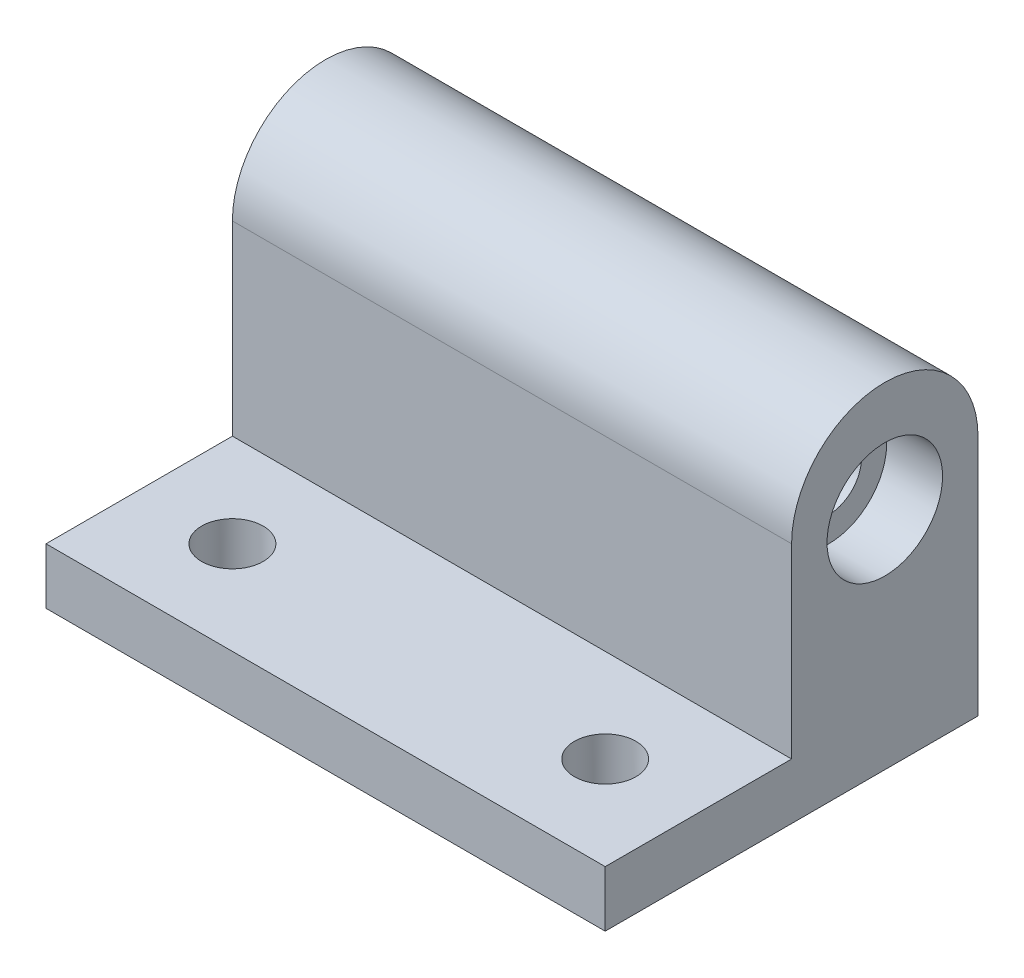
ISO-10303-21;
HEADER;
FILE_DESCRIPTION(('STEP AP214'),'2;1');
FILE_NAME('part.step','',(''),(''),'','','');
FILE_SCHEMA(('AUTOMOTIVE_DESIGN { 1 0 10303 214 1 1 1 1 }'));
ENDSEC;
DATA;
#1=APPLICATION_CONTEXT('core data for automotive mechanical design processes');
#2=APPLICATION_PROTOCOL_DEFINITION('international standard','automotive_design',2000,#1);
#3=PRODUCT_CONTEXT('',#1,'mechanical');
#4=PRODUCT('Part','Part','',(#3));
#5=PRODUCT_RELATED_PRODUCT_CATEGORY('part','',(#4));
#6=PRODUCT_DEFINITION_FORMATION('','',#4);
#7=PRODUCT_DEFINITION_CONTEXT('part definition',#1,'design');
#8=PRODUCT_DEFINITION('design','',#6,#7);
#9=PRODUCT_DEFINITION_SHAPE('','',#8);
#10=(LENGTH_UNIT() NAMED_UNIT(*) SI_UNIT(.MILLI.,.METRE.));
#11=(NAMED_UNIT(*) PLANE_ANGLE_UNIT() SI_UNIT($,.RADIAN.));
#12=(NAMED_UNIT(*) SI_UNIT($,.STERADIAN.) SOLID_ANGLE_UNIT());
#13=UNCERTAINTY_MEASURE_WITH_UNIT(LENGTH_MEASURE(1.E-05),#10,'distance_accuracy_value','');
#14=(GEOMETRIC_REPRESENTATION_CONTEXT(3) GLOBAL_UNCERTAINTY_ASSIGNED_CONTEXT((#13)) GLOBAL_UNIT_ASSIGNED_CONTEXT((#10,
#11,#12)) REPRESENTATION_CONTEXT('',''));
#15=CARTESIAN_POINT('',(0.,0.,0.));
#16=DIRECTION('',(0.,0.,1.));
#17=DIRECTION('',(1.,0.,0.));
#18=AXIS2_PLACEMENT_3D('',#15,#16,#17);
#19=CARTESIAN_POINT('',(-15.,12.1,0.));
#20=DIRECTION('',(1.,0.,0.));
#21=DIRECTION('',(0.,0.,-1.));
#22=AXIS2_PLACEMENT_3D('',#19,#20,#21);
#23=CYLINDRICAL_SURFACE('',#22,1.75);
#24=CARTESIAN_POINT('',(12.,12.1,0.));
#25=DIRECTION('',(1.,0.,0.));
#26=DIRECTION('',(0.,0.,-1.));
#27=AXIS2_PLACEMENT_3D('',#24,#25,#26);
#28=CIRCLE('',#27,1.75);
#29=CARTESIAN_POINT('',(12.,12.1,-1.75));
#30=VERTEX_POINT('',#29);
#31=EDGE_CURVE('E171',#30,#30,#28,.T.);
#32=ORIENTED_EDGE('',*,*,#31,.T.);
#33=EDGE_LOOP('',(#32));
#34=FACE_BOUND('',#33,.T.);
#35=CARTESIAN_POINT('',(-12.,12.1,0.));
#36=DIRECTION('',(-1.,0.,0.));
#37=DIRECTION('',(0.,0.,1.));
#38=AXIS2_PLACEMENT_3D('',#35,#36,#37);
#39=CIRCLE('',#38,1.75);
#40=CARTESIAN_POINT('',(-12.,12.1,1.75));
#41=VERTEX_POINT('',#40);
#42=EDGE_CURVE('E167',#41,#41,#39,.F.);
#43=ORIENTED_EDGE('',*,*,#42,.F.);
#44=EDGE_LOOP('',(#43));
#45=FACE_BOUND('',#44,.T.);
#46=ADVANCED_FACE('F43',(#34,#45),#23,.F.);
#47=CARTESIAN_POINT('',(15.,22.1,-15.));
#48=DIRECTION('',(-1.,0.,0.));
#49=DIRECTION('',(0.,0.,1.));
#50=AXIS2_PLACEMENT_3D('',#47,#48,#49);
#51=PLANE('',#50);
#52=CARTESIAN_POINT('',(15.,12.1,0.));
#53=DIRECTION('',(1.,0.,0.));
#54=DIRECTION('',(0.,0.,-1.));
#55=AXIS2_PLACEMENT_3D('',#52,#53,#54);
#56=CIRCLE('',#55,3.1);
#57=CARTESIAN_POINT('',(15.,12.1,-3.1));
#58=VERTEX_POINT('',#57);
#59=EDGE_CURVE('E175',#58,#58,#56,.T.);
#60=ORIENTED_EDGE('',*,*,#59,.F.);
#61=EDGE_LOOP('',(#60));
#62=FACE_BOUND('',#61,.T.);
#63=DIRECTION('',(0.,-1.,0.));
#64=VECTOR('',#63,1.);
#65=CARTESIAN_POINT('',(15.,13.,4.99999999999999));
#66=LINE('',#65,#64);
#67=CARTESIAN_POINT('',(15.,13.,4.99999999999999));
#68=VERTEX_POINT('',#67);
#69=CARTESIAN_POINT('',(15.,3.,4.99999999999999));
#70=VERTEX_POINT('',#69);
#71=EDGE_CURVE('E115',#68,#70,#66,.T.);
#72=ORIENTED_EDGE('',*,*,#71,.T.);
#73=DIRECTION('',(0.,0.,1.));
#74=VECTOR('',#73,1.);
#75=CARTESIAN_POINT('',(15.,3.,4.99999999999999));
#76=LINE('',#75,#74);
#77=CARTESIAN_POINT('',(15.,3.,15.));
#78=VERTEX_POINT('',#77);
#79=EDGE_CURVE('E128',#70,#78,#76,.T.);
#80=ORIENTED_EDGE('',*,*,#79,.T.);
#81=DIRECTION('',(0.,-1.,0.));
#82=VECTOR('',#81,1.);
#83=CARTESIAN_POINT('',(15.,22.1,15.));
#84=LINE('',#83,#82);
#85=CARTESIAN_POINT('',(15.,0.,15.));
#86=VERTEX_POINT('',#85);
#87=EDGE_CURVE('E53',#78,#86,#84,.T.);
#88=ORIENTED_EDGE('',*,*,#87,.T.);
#89=DIRECTION('',(0.,0.,-1.));
#90=VECTOR('',#89,1.);
#91=CARTESIAN_POINT('',(15.,0.,-15.));
#92=LINE('',#91,#90);
#93=CARTESIAN_POINT('',(15.,0.,-5.00000000000001));
#94=VERTEX_POINT('',#93);
#95=EDGE_CURVE('E118',#86,#94,#92,.T.);
#96=ORIENTED_EDGE('',*,*,#95,.T.);
#97=DIRECTION('',(0.,1.,0.));
#98=VECTOR('',#97,1.);
#99=CARTESIAN_POINT('',(15.,3.,-5.));
#100=LINE('',#99,#98);
#101=CARTESIAN_POINT('',(15.,13.,-5.00000000000001));
#102=VERTEX_POINT('',#101);
#103=EDGE_CURVE('E61',#94,#102,#100,.T.);
#104=ORIENTED_EDGE('',*,*,#103,.T.);
#105=CARTESIAN_POINT('',(15.,13.,0.));
#106=DIRECTION('',(1.,0.,0.));
#107=DIRECTION('',(0.,0.,-1.));
#108=AXIS2_PLACEMENT_3D('',#105,#106,#107);
#109=CIRCLE('',#108,5.);
#110=EDGE_CURVE('E110',#102,#68,#109,.T.);
#111=ORIENTED_EDGE('',*,*,#110,.T.);
#112=EDGE_LOOP('',(#72,#80,#88,#96,#104,#111));
#113=FACE_BOUND('',#112,.T.);
#114=ADVANCED_FACE('F45',(#62,#113),#51,.F.);
#115=CARTESIAN_POINT('',(-15.,22.1,-15.));
#116=DIRECTION('',(1.,0.,0.));
#117=DIRECTION('',(0.,0.,-1.));
#118=AXIS2_PLACEMENT_3D('',#115,#116,#117);
#119=PLANE('',#118);
#120=CARTESIAN_POINT('',(-15.,12.1,0.));
#121=DIRECTION('',(-1.,0.,0.));
#122=DIRECTION('',(0.,0.,1.));
#123=AXIS2_PLACEMENT_3D('',#120,#121,#122);
#124=CIRCLE('',#123,3.1);
#125=CARTESIAN_POINT('',(-15.,12.1,3.1));
#126=VERTEX_POINT('',#125);
#127=EDGE_CURVE('E159',#126,#126,#124,.T.);
#128=ORIENTED_EDGE('',*,*,#127,.F.);
#129=EDGE_LOOP('',(#128));
#130=FACE_BOUND('',#129,.T.);
#131=DIRECTION('',(0.,-1.,0.));
#132=VECTOR('',#131,1.);
#133=CARTESIAN_POINT('',(-15.,22.1,15.));
#134=LINE('',#133,#132);
#135=CARTESIAN_POINT('',(-15.,3.,15.));
#136=VERTEX_POINT('',#135);
#137=CARTESIAN_POINT('',(-15.,0.,15.));
#138=VERTEX_POINT('',#137);
#139=EDGE_CURVE('E11',#136,#138,#134,.T.);
#140=ORIENTED_EDGE('',*,*,#139,.F.);
#141=DIRECTION('',(0.,0.,1.));
#142=VECTOR('',#141,1.);
#143=CARTESIAN_POINT('',(-15.,3.,5.));
#144=LINE('',#143,#142);
#145=CARTESIAN_POINT('',(-15.,3.,5.));
#146=VERTEX_POINT('',#145);
#147=EDGE_CURVE('E120',#146,#136,#144,.T.);
#148=ORIENTED_EDGE('',*,*,#147,.F.);
#149=DIRECTION('',(0.,-1.,0.));
#150=VECTOR('',#149,1.);
#151=CARTESIAN_POINT('',(-15.,13.,5.));
#152=LINE('',#151,#150);
#153=CARTESIAN_POINT('',(-15.,13.,5.));
#154=VERTEX_POINT('',#153);
#155=EDGE_CURVE('E123',#154,#146,#152,.T.);
#156=ORIENTED_EDGE('',*,*,#155,.F.);
#157=CARTESIAN_POINT('',(-15.,13.,0.));
#158=DIRECTION('',(1.,0.,0.));
#159=DIRECTION('',(0.,0.,-1.));
#160=AXIS2_PLACEMENT_3D('',#157,#158,#159);
#161=CIRCLE('',#160,5.);
#162=CARTESIAN_POINT('',(-15.,13.,-5.));
#163=VERTEX_POINT('',#162);
#164=EDGE_CURVE('E133',#163,#154,#161,.T.);
#165=ORIENTED_EDGE('',*,*,#164,.F.);
#166=DIRECTION('',(0.,1.,0.));
#167=VECTOR('',#166,1.);
#168=CARTESIAN_POINT('',(-15.,3.,-5.));
#169=LINE('',#168,#167);
#170=CARTESIAN_POINT('',(-15.,0.,-5.));
#171=VERTEX_POINT('',#170);
#172=EDGE_CURVE('E101',#171,#163,#169,.T.);
#173=ORIENTED_EDGE('',*,*,#172,.F.);
#174=DIRECTION('',(0.,0.,1.));
#175=VECTOR('',#174,1.);
#176=CARTESIAN_POINT('',(-15.,0.,-15.));
#177=LINE('',#176,#175);
#178=EDGE_CURVE('E185',#171,#138,#177,.T.);
#179=ORIENTED_EDGE('',*,*,#178,.T.);
#180=EDGE_LOOP('',(#140,#148,#156,#165,#173,#179));
#181=FACE_BOUND('',#180,.T.);
#182=ADVANCED_FACE('F205',(#130,#181),#119,.F.);
#183=CARTESIAN_POINT('',(-15.,22.1,15.));
#184=DIRECTION('',(0.,0.,-1.));
#185=DIRECTION('',(-1.,0.,0.));
#186=AXIS2_PLACEMENT_3D('',#183,#184,#185);
#187=PLANE('',#186);
#188=ORIENTED_EDGE('',*,*,#87,.F.);
#189=DIRECTION('',(-1.,0.,0.));
#190=VECTOR('',#189,1.);
#191=CARTESIAN_POINT('',(15.,3.,15.));
#192=LINE('',#191,#190);
#193=EDGE_CURVE('E139',#78,#136,#192,.T.);
#194=ORIENTED_EDGE('',*,*,#193,.T.);
#195=ORIENTED_EDGE('',*,*,#139,.T.);
#196=DIRECTION('',(1.,0.,0.));
#197=VECTOR('',#196,1.);
#198=CARTESIAN_POINT('',(-15.,0.,15.));
#199=LINE('',#198,#197);
#200=EDGE_CURVE('E189',#138,#86,#199,.T.);
#201=ORIENTED_EDGE('',*,*,#200,.T.);
#202=EDGE_LOOP('',(#188,#194,#195,#201));
#203=FACE_BOUND('',#202,.T.);
#204=ADVANCED_FACE('F222',(#203),#187,.F.);
#205=CARTESIAN_POINT('',(0.,0.,0.));
#206=DIRECTION('',(0.,1.,0.));
#207=DIRECTION('',(0.,0.,1.));
#208=AXIS2_PLACEMENT_3D('',#205,#206,#207);
#209=PLANE('',#208);
#210=CARTESIAN_POINT('',(-10.,0.,10.));
#211=DIRECTION('',(0.,1.,0.));
#212=DIRECTION('',(0.,0.,1.));
#213=AXIS2_PLACEMENT_3D('',#210,#211,#212);
#214=CIRCLE('',#213,1.64955961301493);
#215=CARTESIAN_POINT('',(-10.,0.,11.6495596130149));
#216=VERTEX_POINT('',#215);
#217=EDGE_CURVE('E154',#216,#216,#214,.T.);
#218=ORIENTED_EDGE('',*,*,#217,.T.);
#219=EDGE_LOOP('',(#218));
#220=FACE_BOUND('',#219,.T.);
#221=CARTESIAN_POINT('',(10.,0.,10.));
#222=DIRECTION('',(0.,1.,0.));
#223=DIRECTION('',(0.,0.,1.));
#224=AXIS2_PLACEMENT_3D('',#221,#222,#223);
#225=CIRCLE('',#224,1.64955961301494);
#226=CARTESIAN_POINT('',(10.,0.,11.6495596130149));
#227=VERTEX_POINT('',#226);
#228=EDGE_CURVE('E155',#227,#227,#225,.T.);
#229=ORIENTED_EDGE('',*,*,#228,.T.);
#230=EDGE_LOOP('',(#229));
#231=FACE_BOUND('',#230,.T.);
#232=ORIENTED_EDGE('',*,*,#178,.F.);
#233=DIRECTION('',(-1.,0.,0.));
#234=VECTOR('',#233,1.);
#235=CARTESIAN_POINT('',(15.,0.,-5.));
#236=LINE('',#235,#234);
#237=EDGE_CURVE('E107',#94,#171,#236,.T.);
#238=ORIENTED_EDGE('',*,*,#237,.F.);
#239=ORIENTED_EDGE('',*,*,#95,.F.);
#240=ORIENTED_EDGE('',*,*,#200,.F.);
#241=EDGE_LOOP('',(#232,#238,#239,#240));
#242=FACE_BOUND('',#241,.T.);
#243=ADVANCED_FACE('F218',(#220,#231,#242),#209,.F.);
#244=CARTESIAN_POINT('',(12.,12.1,0.));
#245=DIRECTION('',(1.,0.,0.));
#246=DIRECTION('',(0.,0.,-1.));
#247=AXIS2_PLACEMENT_3D('',#244,#245,#246);
#248=CYLINDRICAL_SURFACE('',#247,3.1);
#249=CARTESIAN_POINT('',(12.,12.1,0.));
#250=DIRECTION('',(1.,0.,0.));
#251=DIRECTION('',(0.,0.,-1.));
#252=AXIS2_PLACEMENT_3D('',#249,#250,#251);
#253=CIRCLE('',#252,3.1);
#254=CARTESIAN_POINT('',(12.,12.1,-3.1));
#255=VERTEX_POINT('',#254);
#256=EDGE_CURVE('E176',#255,#255,#253,.T.);
#257=ORIENTED_EDGE('',*,*,#256,.F.);
#258=EDGE_LOOP('',(#257));
#259=FACE_BOUND('',#258,.T.);
#260=ORIENTED_EDGE('',*,*,#59,.T.);
#261=EDGE_LOOP('',(#260));
#262=FACE_BOUND('',#261,.T.);
#263=ADVANCED_FACE('F214',(#259,#262),#248,.F.);
#264=CARTESIAN_POINT('',(12.,12.1,0.));
#265=DIRECTION('',(1.,0.,0.));
#266=DIRECTION('',(0.,0.,-1.));
#267=AXIS2_PLACEMENT_3D('',#264,#265,#266);
#268=PLANE('',#267);
#269=ORIENTED_EDGE('',*,*,#31,.F.);
#270=EDGE_LOOP('',(#269));
#271=FACE_BOUND('',#270,.T.);
#272=ORIENTED_EDGE('',*,*,#256,.T.);
#273=EDGE_LOOP('',(#272));
#274=FACE_BOUND('',#273,.T.);
#275=ADVANCED_FACE('F211',(#271,#274),#268,.T.);
#276=CARTESIAN_POINT('',(-12.,12.1,0.));
#277=DIRECTION('',(-1.,0.,0.));
#278=DIRECTION('',(0.,0.,1.));
#279=AXIS2_PLACEMENT_3D('',#276,#277,#278);
#280=PLANE('',#279);
#281=CARTESIAN_POINT('',(-12.,12.1,0.));
#282=DIRECTION('',(-1.,0.,0.));
#283=DIRECTION('',(0.,0.,1.));
#284=AXIS2_PLACEMENT_3D('',#281,#282,#283);
#285=CIRCLE('',#284,3.1);
#286=CARTESIAN_POINT('',(-12.,12.1,3.1));
#287=VERTEX_POINT('',#286);
#288=EDGE_CURVE('E163',#287,#287,#285,.T.);
#289=ORIENTED_EDGE('',*,*,#288,.T.);
#290=EDGE_LOOP('',(#289));
#291=FACE_BOUND('',#290,.T.);
#292=ORIENTED_EDGE('',*,*,#42,.T.);
#293=EDGE_LOOP('',(#292));
#294=FACE_BOUND('',#293,.T.);
#295=ADVANCED_FACE('F197',(#291,#294),#280,.T.);
#296=CARTESIAN_POINT('',(-12.,12.1,0.));
#297=DIRECTION('',(-1.,0.,0.));
#298=DIRECTION('',(0.,0.,1.));
#299=AXIS2_PLACEMENT_3D('',#296,#297,#298);
#300=CYLINDRICAL_SURFACE('',#299,3.1);
#301=ORIENTED_EDGE('',*,*,#288,.F.);
#302=EDGE_LOOP('',(#301));
#303=FACE_BOUND('',#302,.T.);
#304=ORIENTED_EDGE('',*,*,#127,.T.);
#305=EDGE_LOOP('',(#304));
#306=FACE_BOUND('',#305,.T.);
#307=ADVANCED_FACE('F209',(#303,#306),#300,.F.);
#308=CARTESIAN_POINT('',(10.,0.,10.));
#309=DIRECTION('',(0.,1.,0.));
#310=DIRECTION('',(0.,0.,1.));
#311=AXIS2_PLACEMENT_3D('',#308,#309,#310);
#312=CYLINDRICAL_SURFACE('',#311,1.64955961301494);
#313=CARTESIAN_POINT('',(10.,3.,10.));
#314=DIRECTION('',(0.,-1.,0.));
#315=DIRECTION('',(0.,0.,-1.));
#316=AXIS2_PLACEMENT_3D('',#313,#314,#315);
#317=CIRCLE('',#316,1.64955961301494);
#318=CARTESIAN_POINT('',(10.,3.,8.35044038698506));
#319=VERTEX_POINT('',#318);
#320=EDGE_CURVE('E150',#319,#319,#317,.F.);
#321=ORIENTED_EDGE('',*,*,#320,.T.);
#322=EDGE_LOOP('',(#321));
#323=FACE_BOUND('',#322,.T.);
#324=ORIENTED_EDGE('',*,*,#228,.F.);
#325=EDGE_LOOP('',(#324));
#326=FACE_BOUND('',#325,.T.);
#327=ADVANCED_FACE('F257',(#323,#326),#312,.F.);
#328=CARTESIAN_POINT('',(-10.,0.,10.));
#329=DIRECTION('',(0.,1.,0.));
#330=DIRECTION('',(0.,0.,1.));
#331=AXIS2_PLACEMENT_3D('',#328,#329,#330);
#332=CYLINDRICAL_SURFACE('',#331,1.64955961301493);
#333=CARTESIAN_POINT('',(-10.,3.,10.));
#334=DIRECTION('',(0.,-1.,0.));
#335=DIRECTION('',(0.,0.,-1.));
#336=AXIS2_PLACEMENT_3D('',#333,#334,#335);
#337=CIRCLE('',#336,1.64955961301493);
#338=CARTESIAN_POINT('',(-10.,3.,8.35044038698507));
#339=VERTEX_POINT('',#338);
#340=EDGE_CURVE('E47',#339,#339,#337,.F.);
#341=ORIENTED_EDGE('',*,*,#340,.T.);
#342=EDGE_LOOP('',(#341));
#343=FACE_BOUND('',#342,.T.);
#344=ORIENTED_EDGE('',*,*,#217,.F.);
#345=EDGE_LOOP('',(#344));
#346=FACE_BOUND('',#345,.T.);
#347=ADVANCED_FACE('F251',(#343,#346),#332,.F.);
#348=CARTESIAN_POINT('',(15.,3.,4.99999999999999));
#349=DIRECTION('',(0.,-1.,0.));
#350=DIRECTION('',(0.,0.,-1.));
#351=AXIS2_PLACEMENT_3D('',#348,#349,#350);
#352=PLANE('',#351);
#353=ORIENTED_EDGE('',*,*,#340,.F.);
#354=EDGE_LOOP('',(#353));
#355=FACE_BOUND('',#354,.T.);
#356=ORIENTED_EDGE('',*,*,#147,.T.);
#357=ORIENTED_EDGE('',*,*,#193,.F.);
#358=ORIENTED_EDGE('',*,*,#79,.F.);
#359=DIRECTION('',(-1.,0.,0.));
#360=VECTOR('',#359,1.);
#361=CARTESIAN_POINT('',(15.,3.,4.99999999999999));
#362=LINE('',#361,#360);
#363=EDGE_CURVE('E143',#70,#146,#362,.T.);
#364=ORIENTED_EDGE('',*,*,#363,.T.);
#365=EDGE_LOOP('',(#356,#357,#358,#364));
#366=FACE_BOUND('',#365,.T.);
#367=ORIENTED_EDGE('',*,*,#320,.F.);
#368=EDGE_LOOP('',(#367));
#369=FACE_BOUND('',#368,.T.);
#370=ADVANCED_FACE('F239',(#355,#366,#369),#352,.F.);
#371=CARTESIAN_POINT('',(15.,13.,4.99999999999999));
#372=DIRECTION('',(0.,0.,-1.));
#373=DIRECTION('',(0.,1.,0.));
#374=AXIS2_PLACEMENT_3D('',#371,#372,#373);
#375=PLANE('',#374);
#376=ORIENTED_EDGE('',*,*,#155,.T.);
#377=ORIENTED_EDGE('',*,*,#363,.F.);
#378=ORIENTED_EDGE('',*,*,#71,.F.);
#379=DIRECTION('',(-1.,0.,0.));
#380=VECTOR('',#379,1.);
#381=CARTESIAN_POINT('',(15.,13.,4.99999999999999));
#382=LINE('',#381,#380);
#383=EDGE_CURVE('E106',#68,#154,#382,.T.);
#384=ORIENTED_EDGE('',*,*,#383,.T.);
#385=EDGE_LOOP('',(#376,#377,#378,#384));
#386=FACE_BOUND('',#385,.T.);
#387=ADVANCED_FACE('F242',(#386),#375,.F.);
#388=CARTESIAN_POINT('',(15.,13.,0.));
#389=DIRECTION('',(-1.,0.,0.));
#390=DIRECTION('',(0.,0.,1.));
#391=AXIS2_PLACEMENT_3D('',#388,#389,#390);
#392=CYLINDRICAL_SURFACE('',#391,5.);
#393=ORIENTED_EDGE('',*,*,#164,.T.);
#394=ORIENTED_EDGE('',*,*,#383,.F.);
#395=ORIENTED_EDGE('',*,*,#110,.F.);
#396=DIRECTION('',(-1.,0.,0.));
#397=VECTOR('',#396,1.);
#398=CARTESIAN_POINT('',(15.,13.,-5.00000000000001));
#399=LINE('',#398,#397);
#400=EDGE_CURVE('E97',#102,#163,#399,.T.);
#401=ORIENTED_EDGE('',*,*,#400,.T.);
#402=EDGE_LOOP('',(#393,#394,#395,#401));
#403=FACE_BOUND('',#402,.T.);
#404=ADVANCED_FACE('F111',(#403),#392,.T.);
#405=CARTESIAN_POINT('',(15.,3.,-5.));
#406=DIRECTION('',(0.,0.,1.));
#407=DIRECTION('',(0.,-1.,0.));
#408=AXIS2_PLACEMENT_3D('',#405,#406,#407);
#409=PLANE('',#408);
#410=ORIENTED_EDGE('',*,*,#172,.T.);
#411=ORIENTED_EDGE('',*,*,#400,.F.);
#412=ORIENTED_EDGE('',*,*,#103,.F.);
#413=ORIENTED_EDGE('',*,*,#237,.T.);
#414=EDGE_LOOP('',(#410,#411,#412,#413));
#415=FACE_BOUND('',#414,.T.);
#416=ADVANCED_FACE('F99',(#415),#409,.F.);
#417=CLOSED_SHELL('',(#46,#114,#182,#204,#243,#263,#275,#295,#307,#327,#347,#370,#387,#404,#416));
#418=MANIFOLD_SOLID_BREP('B2',#417);
#419=ADVANCED_BREP_SHAPE_REPRESENTATION('',(#18,#418),#14);
#420=SHAPE_DEFINITION_REPRESENTATION(#9,#419);
ENDSEC;
END-ISO-10303-21;
